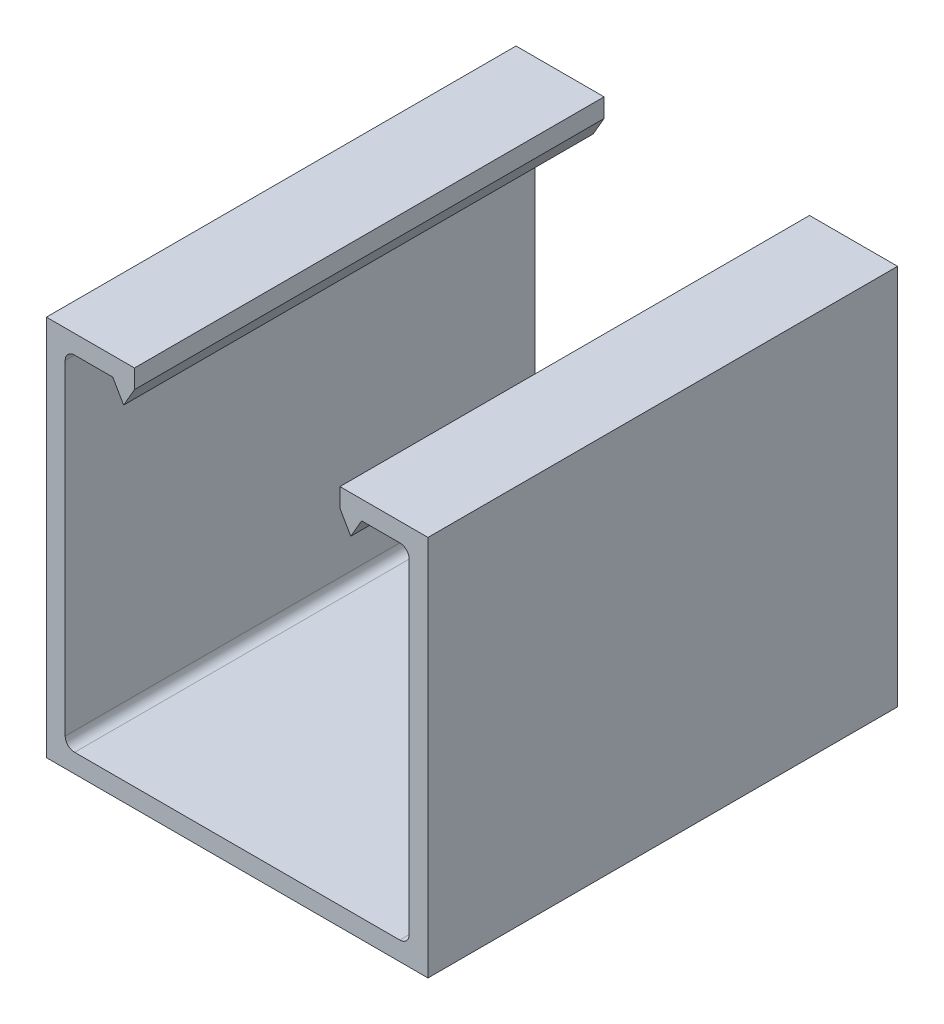
ISO-10303-21;
HEADER;
FILE_DESCRIPTION(('STEP AP214'),'2;1');
FILE_NAME('part.step','',(''),(''),'','','');
FILE_SCHEMA(('AUTOMOTIVE_DESIGN { 1 0 10303 214 1 1 1 1 }'));
ENDSEC;
DATA;
#1=APPLICATION_CONTEXT('core data for automotive mechanical design processes');
#2=APPLICATION_PROTOCOL_DEFINITION('international standard','automotive_design',2000,#1);
#3=PRODUCT_CONTEXT('',#1,'mechanical');
#4=PRODUCT('Part','Part','',(#3));
#5=PRODUCT_RELATED_PRODUCT_CATEGORY('part','',(#4));
#6=PRODUCT_DEFINITION_FORMATION('','',#4);
#7=PRODUCT_DEFINITION_CONTEXT('part definition',#1,'design');
#8=PRODUCT_DEFINITION('design','',#6,#7);
#9=PRODUCT_DEFINITION_SHAPE('','',#8);
#10=(LENGTH_UNIT() NAMED_UNIT(*) SI_UNIT(.MILLI.,.METRE.));
#11=(NAMED_UNIT(*) PLANE_ANGLE_UNIT() SI_UNIT($,.RADIAN.));
#12=(NAMED_UNIT(*) SI_UNIT($,.STERADIAN.) SOLID_ANGLE_UNIT());
#13=UNCERTAINTY_MEASURE_WITH_UNIT(LENGTH_MEASURE(1.E-05),#10,'distance_accuracy_value','');
#14=(GEOMETRIC_REPRESENTATION_CONTEXT(3) GLOBAL_UNCERTAINTY_ASSIGNED_CONTEXT((#13)) GLOBAL_UNIT_ASSIGNED_CONTEXT((#10,
#11,#12)) REPRESENTATION_CONTEXT('',''));
#15=CARTESIAN_POINT('',(0.,0.,0.));
#16=DIRECTION('',(0.,0.,1.));
#17=DIRECTION('',(1.,0.,0.));
#18=AXIS2_PLACEMENT_3D('',#15,#16,#17);
#19=CARTESIAN_POINT('',(-8.79475,-8.79475,12.7));
#20=DIRECTION('',(0.,0.,-1.));
#21=DIRECTION('',(-1.,0.,0.));
#22=AXIS2_PLACEMENT_3D('',#19,#20,#21);
#23=CYLINDRICAL_SURFACE('',#22,0.508);
#24=CARTESIAN_POINT('',(-8.79475,-8.79475,-12.7));
#25=DIRECTION('',(0.,0.,-1.));
#26=DIRECTION('',(1.,0.,0.));
#27=AXIS2_PLACEMENT_3D('',#24,#25,#26);
#28=CIRCLE('',#27,0.508);
#29=CARTESIAN_POINT('',(-8.79475,-9.30275,-12.7));
#30=VERTEX_POINT('',#29);
#31=CARTESIAN_POINT('',(-9.30275,-8.79475,-12.7));
#32=VERTEX_POINT('',#31);
#33=EDGE_CURVE('E200',#30,#32,#28,.T.);
#34=ORIENTED_EDGE('',*,*,#33,.T.);
#35=DIRECTION('',(0.,0.,-1.));
#36=VECTOR('',#35,1.);
#37=CARTESIAN_POINT('',(-9.30275,-8.79475,12.7));
#38=LINE('',#37,#36);
#39=CARTESIAN_POINT('',(-9.30275,-8.79475,12.7));
#40=VERTEX_POINT('',#39);
#41=EDGE_CURVE('E11',#40,#32,#38,.T.);
#42=ORIENTED_EDGE('',*,*,#41,.F.);
#43=CARTESIAN_POINT('',(-8.79475,-8.79475,12.7));
#44=DIRECTION('',(0.,0.,-1.));
#45=DIRECTION('',(1.,0.,0.));
#46=AXIS2_PLACEMENT_3D('',#43,#44,#45);
#47=CIRCLE('',#46,0.508);
#48=CARTESIAN_POINT('',(-8.79475,-9.30275,12.7));
#49=VERTEX_POINT('',#48);
#50=EDGE_CURVE('E238',#49,#40,#47,.T.);
#51=ORIENTED_EDGE('',*,*,#50,.F.);
#52=DIRECTION('',(0.,0.,-1.));
#53=VECTOR('',#52,1.);
#54=CARTESIAN_POINT('',(-8.79475,-9.30275,12.7));
#55=LINE('',#54,#53);
#56=EDGE_CURVE('E196',#49,#30,#55,.T.);
#57=ORIENTED_EDGE('',*,*,#56,.T.);
#58=EDGE_LOOP('',(#34,#42,#51,#57));
#59=FACE_BOUND('',#58,.T.);
#60=ADVANCED_FACE('F32',(#59),#23,.F.);
#61=CARTESIAN_POINT('',(-9.30275,8.79475,12.7));
#62=DIRECTION('',(-1.,0.,0.));
#63=DIRECTION('',(0.,-1.,0.));
#64=AXIS2_PLACEMENT_3D('',#61,#62,#63);
#65=PLANE('',#64);
#66=DIRECTION('',(0.,1.,0.));
#67=VECTOR('',#66,1.);
#68=CARTESIAN_POINT('',(-9.30275,8.79475,-12.7));
#69=LINE('',#68,#67);
#70=CARTESIAN_POINT('',(-9.30275,8.79475,-12.7));
#71=VERTEX_POINT('',#70);
#72=EDGE_CURVE('E203',#32,#71,#69,.T.);
#73=ORIENTED_EDGE('',*,*,#72,.T.);
#74=DIRECTION('',(0.,0.,-1.));
#75=VECTOR('',#74,1.);
#76=CARTESIAN_POINT('',(-9.30275,8.79475,12.7));
#77=LINE('',#76,#75);
#78=CARTESIAN_POINT('',(-9.30275,8.79475,12.7));
#79=VERTEX_POINT('',#78);
#80=EDGE_CURVE('E40',#79,#71,#77,.T.);
#81=ORIENTED_EDGE('',*,*,#80,.F.);
#82=DIRECTION('',(0.,1.,0.));
#83=VECTOR('',#82,1.);
#84=CARTESIAN_POINT('',(-9.30275,8.79475,12.7));
#85=LINE('',#84,#83);
#86=EDGE_CURVE('E127',#40,#79,#85,.T.);
#87=ORIENTED_EDGE('',*,*,#86,.F.);
#88=ORIENTED_EDGE('',*,*,#41,.T.);
#89=EDGE_LOOP('',(#73,#81,#87,#88));
#90=FACE_BOUND('',#89,.T.);
#91=ADVANCED_FACE('F356',(#90),#65,.F.);
#92=CARTESIAN_POINT('',(-8.79475,8.79475,12.7));
#93=DIRECTION('',(0.,0.,-1.));
#94=DIRECTION('',(-1.,0.,0.));
#95=AXIS2_PLACEMENT_3D('',#92,#93,#94);
#96=CYLINDRICAL_SURFACE('',#95,0.508000000000001);
#97=CARTESIAN_POINT('',(-8.79475,8.79475,-12.7));
#98=DIRECTION('',(0.,0.,-1.));
#99=DIRECTION('',(1.,0.,0.));
#100=AXIS2_PLACEMENT_3D('',#97,#98,#99);
#101=CIRCLE('',#100,0.508000000000001);
#102=CARTESIAN_POINT('',(-8.79475,9.30275,-12.7));
#103=VERTEX_POINT('',#102);
#104=EDGE_CURVE('E205',#71,#103,#101,.T.);
#105=ORIENTED_EDGE('',*,*,#104,.T.);
#106=DIRECTION('',(0.,0.,-1.));
#107=VECTOR('',#106,1.);
#108=CARTESIAN_POINT('',(-8.79475,9.30275,12.7));
#109=LINE('',#108,#107);
#110=CARTESIAN_POINT('',(-8.79475,9.30275,12.7));
#111=VERTEX_POINT('',#110);
#112=EDGE_CURVE('E281',#111,#103,#109,.T.);
#113=ORIENTED_EDGE('',*,*,#112,.F.);
#114=CARTESIAN_POINT('',(-8.79475,8.79475,12.7));
#115=DIRECTION('',(0.,0.,-1.));
#116=DIRECTION('',(1.,0.,0.));
#117=AXIS2_PLACEMENT_3D('',#114,#115,#116);
#118=CIRCLE('',#117,0.508000000000001);
#119=EDGE_CURVE('E289',#79,#111,#118,.T.);
#120=ORIENTED_EDGE('',*,*,#119,.F.);
#121=ORIENTED_EDGE('',*,*,#80,.T.);
#122=EDGE_LOOP('',(#105,#113,#120,#121));
#123=FACE_BOUND('',#122,.T.);
#124=ADVANCED_FACE('F287',(#123),#96,.F.);
#125=CARTESIAN_POINT('',(-6.72942574699331,9.30275,12.7));
#126=DIRECTION('',(0.,1.,0.));
#127=DIRECTION('',(-1.,0.,0.));
#128=AXIS2_PLACEMENT_3D('',#125,#126,#127);
#129=PLANE('',#128);
#130=DIRECTION('',(1.,0.,0.));
#131=VECTOR('',#130,1.);
#132=CARTESIAN_POINT('',(-6.72942574699331,9.30275,-12.7));
#133=LINE('',#132,#131);
#134=CARTESIAN_POINT('',(-6.72942574699331,9.30275,-12.7));
#135=VERTEX_POINT('',#134);
#136=EDGE_CURVE('E207',#103,#135,#133,.T.);
#137=ORIENTED_EDGE('',*,*,#136,.T.);
#138=DIRECTION('',(0.,0.,-1.));
#139=VECTOR('',#138,1.);
#140=CARTESIAN_POINT('',(-6.72942574699331,9.30275,12.7));
#141=LINE('',#140,#139);
#142=CARTESIAN_POINT('',(-6.72942574699331,9.30275,12.7));
#143=VERTEX_POINT('',#142);
#144=EDGE_CURVE('E278',#143,#135,#141,.T.);
#145=ORIENTED_EDGE('',*,*,#144,.F.);
#146=DIRECTION('',(1.,0.,0.));
#147=VECTOR('',#146,1.);
#148=CARTESIAN_POINT('',(-6.72942574699331,9.30275,12.7));
#149=LINE('',#148,#147);
#150=EDGE_CURVE('E307',#111,#143,#149,.T.);
#151=ORIENTED_EDGE('',*,*,#150,.F.);
#152=ORIENTED_EDGE('',*,*,#112,.T.);
#153=EDGE_LOOP('',(#137,#145,#151,#152));
#154=FACE_BOUND('',#153,.T.);
#155=ADVANCED_FACE('F298',(#154),#129,.F.);
#156=CARTESIAN_POINT('',(-6.72942574699331,9.30275,12.7));
#157=DIRECTION('',(0.866025404088333,0.49999999947364,0.));
#158=DIRECTION('',(-0.49999999947364,0.866025404088333,0.));
#159=AXIS2_PLACEMENT_3D('',#156,#157,#158);
#160=PLANE('',#159);
#161=DIRECTION('',(0.49999999947364,-0.866025404088333,0.));
#162=VECTOR('',#161,1.);
#163=CARTESIAN_POINT('',(-6.72942574699331,9.30275,-12.7));
#164=LINE('',#163,#162);
#165=CARTESIAN_POINT('',(-6.14283787432,8.28675,-12.7));
#166=VERTEX_POINT('',#165);
#167=EDGE_CURVE('E209',#135,#166,#164,.T.);
#168=ORIENTED_EDGE('',*,*,#167,.T.);
#169=DIRECTION('',(0.,0.,-1.));
#170=VECTOR('',#169,1.);
#171=CARTESIAN_POINT('',(-6.14283787432,8.28675,12.7));
#172=LINE('',#171,#170);
#173=CARTESIAN_POINT('',(-6.14283787432,8.28675,12.7));
#174=VERTEX_POINT('',#173);
#175=EDGE_CURVE('E275',#174,#166,#172,.T.);
#176=ORIENTED_EDGE('',*,*,#175,.F.);
#177=DIRECTION('',(0.49999999947364,-0.866025404088333,0.));
#178=VECTOR('',#177,1.);
#179=CARTESIAN_POINT('',(-6.72942574699331,9.30275,12.7));
#180=LINE('',#179,#178);
#181=EDGE_CURVE('E304',#143,#174,#180,.T.);
#182=ORIENTED_EDGE('',*,*,#181,.F.);
#183=ORIENTED_EDGE('',*,*,#144,.T.);
#184=EDGE_LOOP('',(#168,#176,#182,#183));
#185=FACE_BOUND('',#184,.T.);
#186=ADVANCED_FACE('F302',(#185),#160,.F.);
#187=CARTESIAN_POINT('',(-6.14283787432,8.28675,12.7));
#188=DIRECTION('',(-0.866025403480546,0.500000000526358,0.));
#189=DIRECTION('',(-0.500000000526358,-0.866025403480546,0.));
#190=AXIS2_PLACEMENT_3D('',#187,#188,#189);
#191=PLANE('',#190);
#192=DIRECTION('',(0.500000000526358,0.866025403480546,0.));
#193=VECTOR('',#192,1.);
#194=CARTESIAN_POINT('',(-6.14283787432,8.28675,-12.7));
#195=LINE('',#194,#193);
#196=CARTESIAN_POINT('',(-5.55625,9.30275,-12.7));
#197=VERTEX_POINT('',#196);
#198=EDGE_CURVE('E211',#166,#197,#195,.T.);
#199=ORIENTED_EDGE('',*,*,#198,.T.);
#200=DIRECTION('',(0.,0.,-1.));
#201=VECTOR('',#200,1.);
#202=CARTESIAN_POINT('',(-5.55625,9.30275,12.7));
#203=LINE('',#202,#201);
#204=CARTESIAN_POINT('',(-5.55625,9.30275,12.7));
#205=VERTEX_POINT('',#204);
#206=EDGE_CURVE('E272',#205,#197,#203,.T.);
#207=ORIENTED_EDGE('',*,*,#206,.F.);
#208=DIRECTION('',(0.500000000526358,0.866025403480546,0.));
#209=VECTOR('',#208,1.);
#210=CARTESIAN_POINT('',(-6.14283787432,8.28675,12.7));
#211=LINE('',#210,#209);
#212=EDGE_CURVE('E306',#174,#205,#211,.T.);
#213=ORIENTED_EDGE('',*,*,#212,.F.);
#214=ORIENTED_EDGE('',*,*,#175,.T.);
#215=EDGE_LOOP('',(#199,#207,#213,#214));
#216=FACE_BOUND('',#215,.T.);
#217=ADVANCED_FACE('F369',(#216),#191,.F.);
#218=CARTESIAN_POINT('',(-5.55625,9.30275,12.7));
#219=DIRECTION('',(-1.,0.,0.));
#220=DIRECTION('',(0.,0.,1.));
#221=AXIS2_PLACEMENT_3D('',#218,#219,#220);
#222=PLANE('',#221);
#223=DIRECTION('',(0.,1.,0.));
#224=VECTOR('',#223,1.);
#225=CARTESIAN_POINT('',(-5.55625,9.30275,-12.7));
#226=LINE('',#225,#224);
#227=CARTESIAN_POINT('',(-5.55625,10.31875,-12.7));
#228=VERTEX_POINT('',#227);
#229=EDGE_CURVE('E213',#197,#228,#226,.T.);
#230=ORIENTED_EDGE('',*,*,#229,.T.);
#231=DIRECTION('',(0.,0.,-1.));
#232=VECTOR('',#231,1.);
#233=CARTESIAN_POINT('',(-5.55625,10.31875,12.7));
#234=LINE('',#233,#232);
#235=CARTESIAN_POINT('',(-5.55625,10.31875,12.7));
#236=VERTEX_POINT('',#235);
#237=EDGE_CURVE('E269',#236,#228,#234,.T.);
#238=ORIENTED_EDGE('',*,*,#237,.F.);
#239=DIRECTION('',(0.,1.,0.));
#240=VECTOR('',#239,1.);
#241=CARTESIAN_POINT('',(-5.55625,9.30275,12.7));
#242=LINE('',#241,#240);
#243=EDGE_CURVE('E309',#205,#236,#242,.T.);
#244=ORIENTED_EDGE('',*,*,#243,.F.);
#245=ORIENTED_EDGE('',*,*,#206,.T.);
#246=EDGE_LOOP('',(#230,#238,#244,#245));
#247=FACE_BOUND('',#246,.T.);
#248=ADVANCED_FACE('F372',(#247),#222,.F.);
#249=CARTESIAN_POINT('',(-5.55625,10.31875,12.7));
#250=DIRECTION('',(0.,-1.,0.));
#251=DIRECTION('',(1.,0.,0.));
#252=AXIS2_PLACEMENT_3D('',#249,#250,#251);
#253=PLANE('',#252);
#254=DIRECTION('',(-1.,0.,0.));
#255=VECTOR('',#254,1.);
#256=CARTESIAN_POINT('',(-5.55625,10.31875,-12.7));
#257=LINE('',#256,#255);
#258=CARTESIAN_POINT('',(-10.31875,10.31875,-12.7));
#259=VERTEX_POINT('',#258);
#260=EDGE_CURVE('E215',#228,#259,#257,.T.);
#261=ORIENTED_EDGE('',*,*,#260,.T.);
#262=DIRECTION('',(0.,0.,-1.));
#263=VECTOR('',#262,1.);
#264=CARTESIAN_POINT('',(-10.31875,10.31875,12.7));
#265=LINE('',#264,#263);
#266=CARTESIAN_POINT('',(-10.31875,10.31875,12.7));
#267=VERTEX_POINT('',#266);
#268=EDGE_CURVE('E266',#267,#259,#265,.T.);
#269=ORIENTED_EDGE('',*,*,#268,.F.);
#270=DIRECTION('',(-1.,0.,0.));
#271=VECTOR('',#270,1.);
#272=CARTESIAN_POINT('',(-5.55625,10.31875,12.7));
#273=LINE('',#272,#271);
#274=EDGE_CURVE('E315',#236,#267,#273,.T.);
#275=ORIENTED_EDGE('',*,*,#274,.F.);
#276=ORIENTED_EDGE('',*,*,#237,.T.);
#277=EDGE_LOOP('',(#261,#269,#275,#276));
#278=FACE_BOUND('',#277,.T.);
#279=ADVANCED_FACE('F376',(#278),#253,.F.);
#280=CARTESIAN_POINT('',(-10.31875,10.31875,12.7));
#281=DIRECTION('',(1.,0.,0.));
#282=DIRECTION('',(0.,1.,0.));
#283=AXIS2_PLACEMENT_3D('',#280,#281,#282);
#284=PLANE('',#283);
#285=DIRECTION('',(0.,-1.,0.));
#286=VECTOR('',#285,1.);
#287=CARTESIAN_POINT('',(-10.31875,10.31875,-12.7));
#288=LINE('',#287,#286);
#289=CARTESIAN_POINT('',(-10.31875,-10.31875,-12.7));
#290=VERTEX_POINT('',#289);
#291=EDGE_CURVE('E217',#259,#290,#288,.T.);
#292=ORIENTED_EDGE('',*,*,#291,.T.);
#293=DIRECTION('',(0.,0.,-1.));
#294=VECTOR('',#293,1.);
#295=CARTESIAN_POINT('',(-10.31875,-10.31875,12.7));
#296=LINE('',#295,#294);
#297=CARTESIAN_POINT('',(-10.31875,-10.31875,12.7));
#298=VERTEX_POINT('',#297);
#299=EDGE_CURVE('E263',#298,#290,#296,.T.);
#300=ORIENTED_EDGE('',*,*,#299,.F.);
#301=DIRECTION('',(0.,-1.,0.));
#302=VECTOR('',#301,1.);
#303=CARTESIAN_POINT('',(-10.31875,10.31875,12.7));
#304=LINE('',#303,#302);
#305=EDGE_CURVE('E317',#267,#298,#304,.T.);
#306=ORIENTED_EDGE('',*,*,#305,.F.);
#307=ORIENTED_EDGE('',*,*,#268,.T.);
#308=EDGE_LOOP('',(#292,#300,#306,#307));
#309=FACE_BOUND('',#308,.T.);
#310=ADVANCED_FACE('F380',(#309),#284,.F.);
#311=CARTESIAN_POINT('',(-10.31875,-10.31875,12.7));
#312=DIRECTION('',(0.,1.,0.));
#313=DIRECTION('',(0.,0.,1.));
#314=AXIS2_PLACEMENT_3D('',#311,#312,#313);
#315=PLANE('',#314);
#316=DIRECTION('',(1.,0.,0.));
#317=VECTOR('',#316,1.);
#318=CARTESIAN_POINT('',(-10.31875,-10.31875,-12.7));
#319=LINE('',#318,#317);
#320=CARTESIAN_POINT('',(10.31875,-10.31875,-12.7));
#321=VERTEX_POINT('',#320);
#322=EDGE_CURVE('E219',#290,#321,#319,.T.);
#323=ORIENTED_EDGE('',*,*,#322,.T.);
#324=DIRECTION('',(0.,0.,-1.));
#325=VECTOR('',#324,1.);
#326=CARTESIAN_POINT('',(10.31875,-10.31875,12.7));
#327=LINE('',#326,#325);
#328=CARTESIAN_POINT('',(10.31875,-10.31875,12.7));
#329=VERTEX_POINT('',#328);
#330=EDGE_CURVE('E260',#329,#321,#327,.T.);
#331=ORIENTED_EDGE('',*,*,#330,.F.);
#332=DIRECTION('',(1.,0.,0.));
#333=VECTOR('',#332,1.);
#334=CARTESIAN_POINT('',(-10.31875,-10.31875,12.7));
#335=LINE('',#334,#333);
#336=EDGE_CURVE('E319',#298,#329,#335,.T.);
#337=ORIENTED_EDGE('',*,*,#336,.F.);
#338=ORIENTED_EDGE('',*,*,#299,.T.);
#339=EDGE_LOOP('',(#323,#331,#337,#338));
#340=FACE_BOUND('',#339,.T.);
#341=ADVANCED_FACE('F384',(#340),#315,.F.);
#342=CARTESIAN_POINT('',(10.31875,-10.31875,12.7));
#343=DIRECTION('',(-1.,0.,0.));
#344=DIRECTION('',(0.,-1.,0.));
#345=AXIS2_PLACEMENT_3D('',#342,#343,#344);
#346=PLANE('',#345);
#347=DIRECTION('',(0.,1.,0.));
#348=VECTOR('',#347,1.);
#349=CARTESIAN_POINT('',(10.31875,-10.31875,-12.7));
#350=LINE('',#349,#348);
#351=CARTESIAN_POINT('',(10.31875,10.31875,-12.7));
#352=VERTEX_POINT('',#351);
#353=EDGE_CURVE('E221',#321,#352,#350,.T.);
#354=ORIENTED_EDGE('',*,*,#353,.T.);
#355=DIRECTION('',(0.,0.,-1.));
#356=VECTOR('',#355,1.);
#357=CARTESIAN_POINT('',(10.31875,10.31875,12.7));
#358=LINE('',#357,#356);
#359=CARTESIAN_POINT('',(10.31875,10.31875,12.7));
#360=VERTEX_POINT('',#359);
#361=EDGE_CURVE('E257',#360,#352,#358,.T.);
#362=ORIENTED_EDGE('',*,*,#361,.F.);
#363=DIRECTION('',(0.,1.,0.));
#364=VECTOR('',#363,1.);
#365=CARTESIAN_POINT('',(10.31875,-10.31875,12.7));
#366=LINE('',#365,#364);
#367=EDGE_CURVE('E321',#329,#360,#366,.T.);
#368=ORIENTED_EDGE('',*,*,#367,.F.);
#369=ORIENTED_EDGE('',*,*,#330,.T.);
#370=EDGE_LOOP('',(#354,#362,#368,#369));
#371=FACE_BOUND('',#370,.T.);
#372=ADVANCED_FACE('F388',(#371),#346,.F.);
#373=CARTESIAN_POINT('',(10.31875,10.31875,12.7));
#374=DIRECTION('',(0.,-1.,0.));
#375=DIRECTION('',(0.,0.,-1.));
#376=AXIS2_PLACEMENT_3D('',#373,#374,#375);
#377=PLANE('',#376);
#378=DIRECTION('',(-1.,0.,0.));
#379=VECTOR('',#378,1.);
#380=CARTESIAN_POINT('',(10.31875,10.31875,-12.7));
#381=LINE('',#380,#379);
#382=CARTESIAN_POINT('',(5.55625,10.31875,-12.7));
#383=VERTEX_POINT('',#382);
#384=EDGE_CURVE('E223',#352,#383,#381,.T.);
#385=ORIENTED_EDGE('',*,*,#384,.T.);
#386=DIRECTION('',(0.,0.,-1.));
#387=VECTOR('',#386,1.);
#388=CARTESIAN_POINT('',(5.55625,10.31875,12.7));
#389=LINE('',#388,#387);
#390=CARTESIAN_POINT('',(5.55625,10.31875,12.7));
#391=VERTEX_POINT('',#390);
#392=EDGE_CURVE('E254',#391,#383,#389,.T.);
#393=ORIENTED_EDGE('',*,*,#392,.F.);
#394=DIRECTION('',(-1.,0.,0.));
#395=VECTOR('',#394,1.);
#396=CARTESIAN_POINT('',(10.31875,10.31875,12.7));
#397=LINE('',#396,#395);
#398=EDGE_CURVE('E323',#360,#391,#397,.T.);
#399=ORIENTED_EDGE('',*,*,#398,.F.);
#400=ORIENTED_EDGE('',*,*,#361,.T.);
#401=EDGE_LOOP('',(#385,#393,#399,#400));
#402=FACE_BOUND('',#401,.T.);
#403=ADVANCED_FACE('F392',(#402),#377,.F.);
#404=CARTESIAN_POINT('',(5.55625,9.30275,12.7));
#405=DIRECTION('',(1.,0.,0.));
#406=DIRECTION('',(0.,1.,0.));
#407=AXIS2_PLACEMENT_3D('',#404,#405,#406);
#408=PLANE('',#407);
#409=DIRECTION('',(0.,-1.,0.));
#410=VECTOR('',#409,1.);
#411=CARTESIAN_POINT('',(5.55625,9.30275,-12.7));
#412=LINE('',#411,#410);
#413=CARTESIAN_POINT('',(5.55625,9.30275,-12.7));
#414=VERTEX_POINT('',#413);
#415=EDGE_CURVE('E225',#383,#414,#412,.T.);
#416=ORIENTED_EDGE('',*,*,#415,.T.);
#417=DIRECTION('',(0.,0.,-1.));
#418=VECTOR('',#417,1.);
#419=CARTESIAN_POINT('',(5.55625,9.30275,12.7));
#420=LINE('',#419,#418);
#421=CARTESIAN_POINT('',(5.55625,9.30275,12.7));
#422=VERTEX_POINT('',#421);
#423=EDGE_CURVE('E251',#422,#414,#420,.T.);
#424=ORIENTED_EDGE('',*,*,#423,.F.);
#425=DIRECTION('',(0.,-1.,0.));
#426=VECTOR('',#425,1.);
#427=CARTESIAN_POINT('',(5.55625,9.30275,12.7));
#428=LINE('',#427,#426);
#429=EDGE_CURVE('E325',#391,#422,#428,.T.);
#430=ORIENTED_EDGE('',*,*,#429,.F.);
#431=ORIENTED_EDGE('',*,*,#392,.T.);
#432=EDGE_LOOP('',(#416,#424,#430,#431));
#433=FACE_BOUND('',#432,.T.);
#434=ADVANCED_FACE('F396',(#433),#408,.F.);
#435=CARTESIAN_POINT('',(6.14283787432,8.28675,12.7));
#436=DIRECTION('',(0.866025403480548,0.500000000526354,0.));
#437=DIRECTION('',(-0.500000000526354,0.866025403480548,0.));
#438=AXIS2_PLACEMENT_3D('',#435,#436,#437);
#439=PLANE('',#438);
#440=DIRECTION('',(0.500000000526354,-0.866025403480548,0.));
#441=VECTOR('',#440,1.);
#442=CARTESIAN_POINT('',(6.14283787432,8.28675,-12.7));
#443=LINE('',#442,#441);
#444=CARTESIAN_POINT('',(6.14283787432,8.28675,-12.7));
#445=VERTEX_POINT('',#444);
#446=EDGE_CURVE('E227',#414,#445,#443,.T.);
#447=ORIENTED_EDGE('',*,*,#446,.T.);
#448=DIRECTION('',(0.,0.,-1.));
#449=VECTOR('',#448,1.);
#450=CARTESIAN_POINT('',(6.14283787432,8.28675,12.7));
#451=LINE('',#450,#449);
#452=CARTESIAN_POINT('',(6.14283787432,8.28675,12.7));
#453=VERTEX_POINT('',#452);
#454=EDGE_CURVE('E248',#453,#445,#451,.T.);
#455=ORIENTED_EDGE('',*,*,#454,.F.);
#456=DIRECTION('',(0.500000000526354,-0.866025403480548,0.));
#457=VECTOR('',#456,1.);
#458=CARTESIAN_POINT('',(6.14283787432,8.28675,12.7));
#459=LINE('',#458,#457);
#460=EDGE_CURVE('E327',#422,#453,#459,.T.);
#461=ORIENTED_EDGE('',*,*,#460,.F.);
#462=ORIENTED_EDGE('',*,*,#423,.T.);
#463=EDGE_LOOP('',(#447,#455,#461,#462));
#464=FACE_BOUND('',#463,.T.);
#465=ADVANCED_FACE('F400',(#464),#439,.F.);
#466=CARTESIAN_POINT('',(6.72942574699331,9.30275,12.7));
#467=DIRECTION('',(-0.866025404088332,0.499999999473642,0.));
#468=DIRECTION('',(-0.499999999473642,-0.866025404088332,0.));
#469=AXIS2_PLACEMENT_3D('',#466,#467,#468);
#470=PLANE('',#469);
#471=DIRECTION('',(0.499999999473642,0.866025404088332,0.));
#472=VECTOR('',#471,1.);
#473=CARTESIAN_POINT('',(6.72942574699331,9.30275,-12.7));
#474=LINE('',#473,#472);
#475=CARTESIAN_POINT('',(6.72942574699331,9.30275,-12.7));
#476=VERTEX_POINT('',#475);
#477=EDGE_CURVE('E229',#445,#476,#474,.T.);
#478=ORIENTED_EDGE('',*,*,#477,.T.);
#479=DIRECTION('',(0.,0.,-1.));
#480=VECTOR('',#479,1.);
#481=CARTESIAN_POINT('',(6.72942574699331,9.30275,12.7));
#482=LINE('',#481,#480);
#483=CARTESIAN_POINT('',(6.72942574699331,9.30275,12.7));
#484=VERTEX_POINT('',#483);
#485=EDGE_CURVE('E245',#484,#476,#482,.T.);
#486=ORIENTED_EDGE('',*,*,#485,.F.);
#487=DIRECTION('',(0.499999999473642,0.866025404088332,0.));
#488=VECTOR('',#487,1.);
#489=CARTESIAN_POINT('',(6.72942574699331,9.30275,12.7));
#490=LINE('',#489,#488);
#491=EDGE_CURVE('E329',#453,#484,#490,.T.);
#492=ORIENTED_EDGE('',*,*,#491,.F.);
#493=ORIENTED_EDGE('',*,*,#454,.T.);
#494=EDGE_LOOP('',(#478,#486,#492,#493));
#495=FACE_BOUND('',#494,.T.);
#496=ADVANCED_FACE('F404',(#495),#470,.F.);
#497=CARTESIAN_POINT('',(8.79475,9.30275,12.7));
#498=DIRECTION('',(0.,1.,0.));
#499=DIRECTION('',(0.,0.,1.));
#500=AXIS2_PLACEMENT_3D('',#497,#498,#499);
#501=PLANE('',#500);
#502=DIRECTION('',(1.,0.,0.));
#503=VECTOR('',#502,1.);
#504=CARTESIAN_POINT('',(8.79475,9.30275,-12.7));
#505=LINE('',#504,#503);
#506=CARTESIAN_POINT('',(8.79475,9.30275,-12.7));
#507=VERTEX_POINT('',#506);
#508=EDGE_CURVE('E231',#476,#507,#505,.T.);
#509=ORIENTED_EDGE('',*,*,#508,.T.);
#510=DIRECTION('',(0.,0.,-1.));
#511=VECTOR('',#510,1.);
#512=CARTESIAN_POINT('',(8.79475,9.30275,12.7));
#513=LINE('',#512,#511);
#514=CARTESIAN_POINT('',(8.79475,9.30275,12.7));
#515=VERTEX_POINT('',#514);
#516=EDGE_CURVE('E242',#515,#507,#513,.T.);
#517=ORIENTED_EDGE('',*,*,#516,.F.);
#518=DIRECTION('',(1.,0.,0.));
#519=VECTOR('',#518,1.);
#520=CARTESIAN_POINT('',(8.79475,9.30275,12.7));
#521=LINE('',#520,#519);
#522=EDGE_CURVE('E331',#484,#515,#521,.T.);
#523=ORIENTED_EDGE('',*,*,#522,.F.);
#524=ORIENTED_EDGE('',*,*,#485,.T.);
#525=EDGE_LOOP('',(#509,#517,#523,#524));
#526=FACE_BOUND('',#525,.T.);
#527=ADVANCED_FACE('F337',(#526),#501,.F.);
#528=CARTESIAN_POINT('',(8.79475,8.79475,12.7));
#529=DIRECTION('',(0.,0.,-1.));
#530=DIRECTION('',(-1.,0.,0.));
#531=AXIS2_PLACEMENT_3D('',#528,#529,#530);
#532=CYLINDRICAL_SURFACE('',#531,0.508);
#533=CARTESIAN_POINT('',(8.79475,8.79475,-12.7));
#534=DIRECTION('',(0.,0.,-1.));
#535=DIRECTION('',(1.,0.,0.));
#536=AXIS2_PLACEMENT_3D('',#533,#534,#535);
#537=CIRCLE('',#536,0.508);
#538=CARTESIAN_POINT('',(9.30275,8.79475,-12.7));
#539=VERTEX_POINT('',#538);
#540=EDGE_CURVE('E233',#507,#539,#537,.T.);
#541=ORIENTED_EDGE('',*,*,#540,.T.);
#542=DIRECTION('',(0.,0.,-1.));
#543=VECTOR('',#542,1.);
#544=CARTESIAN_POINT('',(9.30275,8.79475,12.7));
#545=LINE('',#544,#543);
#546=CARTESIAN_POINT('',(9.30275,8.79475,12.7));
#547=VERTEX_POINT('',#546);
#548=EDGE_CURVE('E191',#547,#539,#545,.T.);
#549=ORIENTED_EDGE('',*,*,#548,.F.);
#550=CARTESIAN_POINT('',(8.79475,8.79475,12.7));
#551=DIRECTION('',(0.,0.,-1.));
#552=DIRECTION('',(1.,0.,0.));
#553=AXIS2_PLACEMENT_3D('',#550,#551,#552);
#554=CIRCLE('',#553,0.508);
#555=EDGE_CURVE('E182',#515,#547,#554,.T.);
#556=ORIENTED_EDGE('',*,*,#555,.F.);
#557=ORIENTED_EDGE('',*,*,#516,.T.);
#558=EDGE_LOOP('',(#541,#549,#556,#557));
#559=FACE_BOUND('',#558,.T.);
#560=ADVANCED_FACE('F341',(#559),#532,.F.);
#561=CARTESIAN_POINT('',(9.30275,-8.79475,12.7));
#562=DIRECTION('',(1.,0.,0.));
#563=DIRECTION('',(0.,1.,0.));
#564=AXIS2_PLACEMENT_3D('',#561,#562,#563);
#565=PLANE('',#564);
#566=DIRECTION('',(0.,-1.,0.));
#567=VECTOR('',#566,1.);
#568=CARTESIAN_POINT('',(9.30275,-8.79475,-12.7));
#569=LINE('',#568,#567);
#570=CARTESIAN_POINT('',(9.30275,-8.79475,-12.7));
#571=VERTEX_POINT('',#570);
#572=EDGE_CURVE('E190',#539,#571,#569,.T.);
#573=ORIENTED_EDGE('',*,*,#572,.T.);
#574=DIRECTION('',(0.,0.,-1.));
#575=VECTOR('',#574,1.);
#576=CARTESIAN_POINT('',(9.30275,-8.79475,12.7));
#577=LINE('',#576,#575);
#578=CARTESIAN_POINT('',(9.30275,-8.79475,12.7));
#579=VERTEX_POINT('',#578);
#580=EDGE_CURVE('E187',#579,#571,#577,.T.);
#581=ORIENTED_EDGE('',*,*,#580,.F.);
#582=DIRECTION('',(0.,-1.,0.));
#583=VECTOR('',#582,1.);
#584=CARTESIAN_POINT('',(9.30275,-8.79475,12.7));
#585=LINE('',#584,#583);
#586=EDGE_CURVE('E176',#547,#579,#585,.T.);
#587=ORIENTED_EDGE('',*,*,#586,.F.);
#588=ORIENTED_EDGE('',*,*,#548,.T.);
#589=EDGE_LOOP('',(#573,#581,#587,#588));
#590=FACE_BOUND('',#589,.T.);
#591=ADVANCED_FACE('F188',(#590),#565,.F.);
#592=CARTESIAN_POINT('',(8.79475,-8.79475,12.7));
#593=DIRECTION('',(0.,0.,-1.));
#594=DIRECTION('',(-1.,0.,0.));
#595=AXIS2_PLACEMENT_3D('',#592,#593,#594);
#596=CYLINDRICAL_SURFACE('',#595,0.508000000000002);
#597=CARTESIAN_POINT('',(8.79475,-8.79475,-12.7));
#598=DIRECTION('',(0.,0.,-1.));
#599=DIRECTION('',(1.,0.,0.));
#600=AXIS2_PLACEMENT_3D('',#597,#598,#599);
#601=CIRCLE('',#600,0.508000000000002);
#602=CARTESIAN_POINT('',(8.79475,-9.30275,-12.7));
#603=VERTEX_POINT('',#602);
#604=EDGE_CURVE('E113',#571,#603,#601,.T.);
#605=ORIENTED_EDGE('',*,*,#604,.T.);
#606=DIRECTION('',(0.,0.,-1.));
#607=VECTOR('',#606,1.);
#608=CARTESIAN_POINT('',(8.79475,-9.30275,12.7));
#609=LINE('',#608,#607);
#610=CARTESIAN_POINT('',(8.79475,-9.30275,12.7));
#611=VERTEX_POINT('',#610);
#612=EDGE_CURVE('E192',#611,#603,#609,.T.);
#613=ORIENTED_EDGE('',*,*,#612,.F.);
#614=CARTESIAN_POINT('',(8.79475,-8.79475,12.7));
#615=DIRECTION('',(0.,0.,-1.));
#616=DIRECTION('',(1.,0.,0.));
#617=AXIS2_PLACEMENT_3D('',#614,#615,#616);
#618=CIRCLE('',#617,0.508000000000002);
#619=EDGE_CURVE('E180',#579,#611,#618,.T.);
#620=ORIENTED_EDGE('',*,*,#619,.F.);
#621=ORIENTED_EDGE('',*,*,#580,.T.);
#622=EDGE_LOOP('',(#605,#613,#620,#621));
#623=FACE_BOUND('',#622,.T.);
#624=ADVANCED_FACE('F194',(#623),#596,.F.);
#625=CARTESIAN_POINT('',(-8.79475,-9.30275,12.7));
#626=DIRECTION('',(0.,-1.,0.));
#627=DIRECTION('',(1.,0.,0.));
#628=AXIS2_PLACEMENT_3D('',#625,#626,#627);
#629=PLANE('',#628);
#630=DIRECTION('',(-1.,0.,0.));
#631=VECTOR('',#630,1.);
#632=CARTESIAN_POINT('',(-8.79475,-9.30275,-12.7));
#633=LINE('',#632,#631);
#634=EDGE_CURVE('E119',#603,#30,#633,.T.);
#635=ORIENTED_EDGE('',*,*,#634,.T.);
#636=ORIENTED_EDGE('',*,*,#56,.F.);
#637=DIRECTION('',(-1.,0.,0.));
#638=VECTOR('',#637,1.);
#639=CARTESIAN_POINT('',(-8.79475,-9.30275,12.7));
#640=LINE('',#639,#638);
#641=EDGE_CURVE('E48',#611,#49,#640,.T.);
#642=ORIENTED_EDGE('',*,*,#641,.F.);
#643=ORIENTED_EDGE('',*,*,#612,.T.);
#644=EDGE_LOOP('',(#635,#636,#642,#643));
#645=FACE_BOUND('',#644,.T.);
#646=ADVANCED_FACE('F345',(#645),#629,.F.);
#647=CARTESIAN_POINT('',(-8.79475,-8.79475,12.7));
#648=DIRECTION('',(0.,0.,1.));
#649=DIRECTION('',(1.,0.,0.));
#650=AXIS2_PLACEMENT_3D('',#647,#648,#649);
#651=PLANE('',#650);
#652=ORIENTED_EDGE('',*,*,#50,.T.);
#653=ORIENTED_EDGE('',*,*,#86,.T.);
#654=ORIENTED_EDGE('',*,*,#119,.T.);
#655=ORIENTED_EDGE('',*,*,#150,.T.);
#656=ORIENTED_EDGE('',*,*,#181,.T.);
#657=ORIENTED_EDGE('',*,*,#212,.T.);
#658=ORIENTED_EDGE('',*,*,#243,.T.);
#659=ORIENTED_EDGE('',*,*,#274,.T.);
#660=ORIENTED_EDGE('',*,*,#305,.T.);
#661=ORIENTED_EDGE('',*,*,#336,.T.);
#662=ORIENTED_EDGE('',*,*,#367,.T.);
#663=ORIENTED_EDGE('',*,*,#398,.T.);
#664=ORIENTED_EDGE('',*,*,#429,.T.);
#665=ORIENTED_EDGE('',*,*,#460,.T.);
#666=ORIENTED_EDGE('',*,*,#491,.T.);
#667=ORIENTED_EDGE('',*,*,#522,.T.);
#668=ORIENTED_EDGE('',*,*,#555,.T.);
#669=ORIENTED_EDGE('',*,*,#586,.T.);
#670=ORIENTED_EDGE('',*,*,#619,.T.);
#671=ORIENTED_EDGE('',*,*,#641,.T.);
#672=EDGE_LOOP('',(#652,#653,#654,#655,#656,#657,#658,#659,#660,#661,#662,#663,#664,#665,#666,
#667,#668,#669,#670,#671));
#673=FACE_BOUND('',#672,.T.);
#674=ADVANCED_FACE('F178',(#673),#651,.T.);
#675=CARTESIAN_POINT('',(-8.79475,-8.79475,-12.7));
#676=DIRECTION('',(0.,0.,1.));
#677=DIRECTION('',(1.,0.,0.));
#678=AXIS2_PLACEMENT_3D('',#675,#676,#677);
#679=PLANE('',#678);
#680=ORIENTED_EDGE('',*,*,#33,.F.);
#681=ORIENTED_EDGE('',*,*,#634,.F.);
#682=ORIENTED_EDGE('',*,*,#604,.F.);
#683=ORIENTED_EDGE('',*,*,#572,.F.);
#684=ORIENTED_EDGE('',*,*,#540,.F.);
#685=ORIENTED_EDGE('',*,*,#508,.F.);
#686=ORIENTED_EDGE('',*,*,#477,.F.);
#687=ORIENTED_EDGE('',*,*,#446,.F.);
#688=ORIENTED_EDGE('',*,*,#415,.F.);
#689=ORIENTED_EDGE('',*,*,#384,.F.);
#690=ORIENTED_EDGE('',*,*,#353,.F.);
#691=ORIENTED_EDGE('',*,*,#322,.F.);
#692=ORIENTED_EDGE('',*,*,#291,.F.);
#693=ORIENTED_EDGE('',*,*,#260,.F.);
#694=ORIENTED_EDGE('',*,*,#229,.F.);
#695=ORIENTED_EDGE('',*,*,#198,.F.);
#696=ORIENTED_EDGE('',*,*,#167,.F.);
#697=ORIENTED_EDGE('',*,*,#136,.F.);
#698=ORIENTED_EDGE('',*,*,#104,.F.);
#699=ORIENTED_EDGE('',*,*,#72,.F.);
#700=EDGE_LOOP('',(#680,#681,#682,#683,#684,#685,#686,#687,#688,#689,#690,#691,#692,#693,#694,
#695,#696,#697,#698,#699));
#701=FACE_BOUND('',#700,.T.);
#702=ADVANCED_FACE('F293',(#701),#679,.F.);
#703=CLOSED_SHELL('',(#60,#91,#124,#155,#186,#217,#248,#279,#310,#341,#372,#403,#434,#465,#496,
#527,#560,#591,#624,#646,#674,#702));
#704=MANIFOLD_SOLID_BREP('B2',#703);
#705=ADVANCED_BREP_SHAPE_REPRESENTATION('',(#18,#704),#14);
#706=SHAPE_DEFINITION_REPRESENTATION(#9,#705);
ENDSEC;
END-ISO-10303-21;
